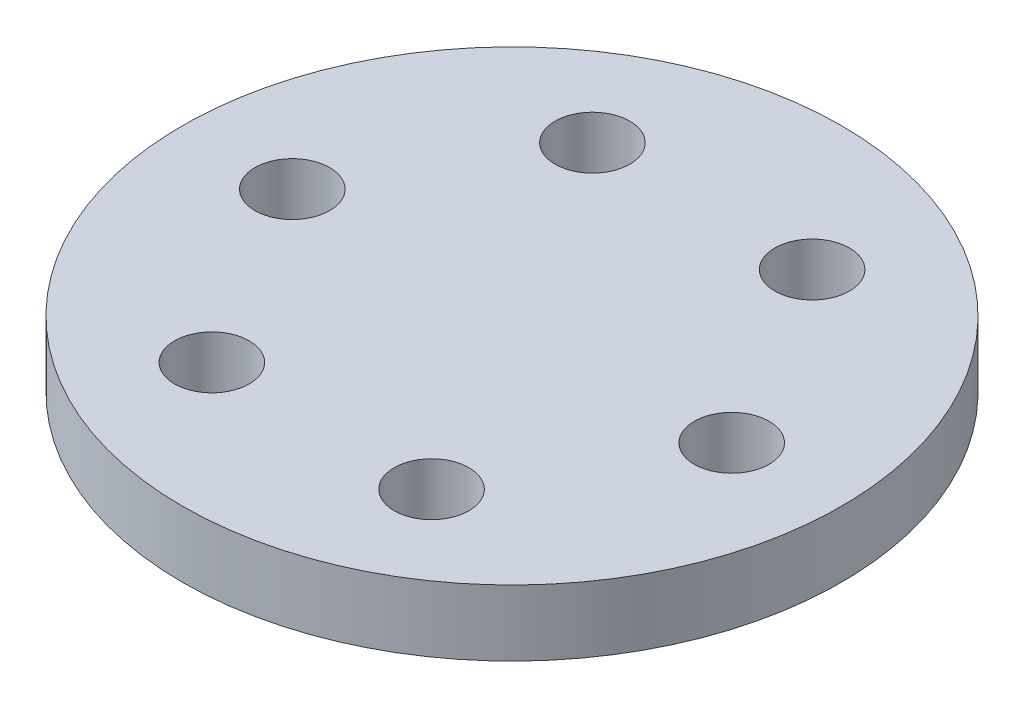
ISO-10303-21;
HEADER;
FILE_DESCRIPTION(('STEP AP214'),'2;1');
FILE_NAME('part.step','',(''),(''),'','','');
FILE_SCHEMA(('AUTOMOTIVE_DESIGN { 1 0 10303 214 1 1 1 1 }'));
ENDSEC;
DATA;
#1=APPLICATION_CONTEXT('core data for automotive mechanical design processes');
#2=APPLICATION_PROTOCOL_DEFINITION('international standard','automotive_design',2000,#1);
#3=PRODUCT_CONTEXT('',#1,'mechanical');
#4=PRODUCT('Part','Part','',(#3));
#5=PRODUCT_RELATED_PRODUCT_CATEGORY('part','',(#4));
#6=PRODUCT_DEFINITION_FORMATION('','',#4);
#7=PRODUCT_DEFINITION_CONTEXT('part definition',#1,'design');
#8=PRODUCT_DEFINITION('design','',#6,#7);
#9=PRODUCT_DEFINITION_SHAPE('','',#8);
#10=(LENGTH_UNIT() NAMED_UNIT(*) SI_UNIT(.MILLI.,.METRE.));
#11=(NAMED_UNIT(*) PLANE_ANGLE_UNIT() SI_UNIT($,.RADIAN.));
#12=(NAMED_UNIT(*) SI_UNIT($,.STERADIAN.) SOLID_ANGLE_UNIT());
#13=UNCERTAINTY_MEASURE_WITH_UNIT(LENGTH_MEASURE(1.E-05),#10,'distance_accuracy_value','');
#14=(GEOMETRIC_REPRESENTATION_CONTEXT(3) GLOBAL_UNCERTAINTY_ASSIGNED_CONTEXT((#13)) GLOBAL_UNIT_ASSIGNED_CONTEXT((#10,
#11,#12)) REPRESENTATION_CONTEXT('',''));
#15=CARTESIAN_POINT('',(0.,0.,0.));
#16=DIRECTION('',(0.,0.,1.));
#17=DIRECTION('',(1.,0.,0.));
#18=AXIS2_PLACEMENT_3D('',#15,#16,#17);
#19=CARTESIAN_POINT('',(0.,3.,0.));
#20=DIRECTION('',(0.,1.,0.));
#21=DIRECTION('',(0.,0.,1.));
#22=AXIS2_PLACEMENT_3D('',#19,#20,#21);
#23=PLANE('',#22);
#24=CARTESIAN_POINT('',(-4.99999999999992,3.,-8.66025403784443));
#25=DIRECTION('',(0.,1.,0.));
#26=DIRECTION('',(0.,0.,1.));
#27=AXIS2_PLACEMENT_3D('',#24,#25,#26);
#28=CIRCLE('',#27,1.7);
#29=CARTESIAN_POINT('',(-4.99999999999992,3.,-6.96025403784443));
#30=VERTEX_POINT('',#29);
#31=EDGE_CURVE('E67',#30,#30,#28,.T.);
#32=ORIENTED_EDGE('',*,*,#31,.F.);
#33=EDGE_LOOP('',(#32));
#34=FACE_BOUND('',#33,.T.);
#35=CARTESIAN_POINT('',(-5.00000000000004,3.,8.66025403784437));
#36=DIRECTION('',(0.,1.,0.));
#37=DIRECTION('',(0.,0.,1.));
#38=AXIS2_PLACEMENT_3D('',#35,#36,#37);
#39=CIRCLE('',#38,1.7);
#40=CARTESIAN_POINT('',(-5.00000000000004,3.,10.3602540378444));
#41=VERTEX_POINT('',#40);
#42=EDGE_CURVE('E55',#41,#41,#39,.T.);
#43=ORIENTED_EDGE('',*,*,#42,.F.);
#44=EDGE_LOOP('',(#43));
#45=FACE_BOUND('',#44,.T.);
#46=CARTESIAN_POINT('',(10.,3.,0.));
#47=DIRECTION('',(0.,1.,0.));
#48=DIRECTION('',(0.,0.,1.));
#49=AXIS2_PLACEMENT_3D('',#46,#47,#48);
#50=CIRCLE('',#49,1.7);
#51=CARTESIAN_POINT('',(10.,3.,1.7));
#52=VERTEX_POINT('',#51);
#53=EDGE_CURVE('E44',#52,#52,#50,.T.);
#54=ORIENTED_EDGE('',*,*,#53,.F.);
#55=EDGE_LOOP('',(#54));
#56=FACE_BOUND('',#55,.T.);
#57=CARTESIAN_POINT('',(0.,3.,0.));
#58=DIRECTION('',(0.,1.,0.));
#59=DIRECTION('',(0.,0.,1.));
#60=AXIS2_PLACEMENT_3D('',#57,#58,#59);
#61=CIRCLE('',#60,15.);
#62=CARTESIAN_POINT('',(0.,3.,15.));
#63=VERTEX_POINT('',#62);
#64=EDGE_CURVE('E10',#63,#63,#61,.T.);
#65=ORIENTED_EDGE('',*,*,#64,.T.);
#66=EDGE_LOOP('',(#65));
#67=FACE_BOUND('',#66,.T.);
#68=CARTESIAN_POINT('',(4.99999999999998,3.,8.6602540378444));
#69=DIRECTION('',(0.,1.,0.));
#70=DIRECTION('',(0.,0.,1.));
#71=AXIS2_PLACEMENT_3D('',#68,#69,#70);
#72=CIRCLE('',#71,1.7);
#73=CARTESIAN_POINT('',(4.99999999999998,3.,10.3602540378444));
#74=VERTEX_POINT('',#73);
#75=EDGE_CURVE('E49',#74,#74,#72,.T.);
#76=ORIENTED_EDGE('',*,*,#75,.F.);
#77=EDGE_LOOP('',(#76));
#78=FACE_BOUND('',#77,.T.);
#79=CARTESIAN_POINT('',(-10.,3.,0.));
#80=DIRECTION('',(0.,1.,0.));
#81=DIRECTION('',(0.,0.,1.));
#82=AXIS2_PLACEMENT_3D('',#79,#80,#81);
#83=CIRCLE('',#82,1.7);
#84=CARTESIAN_POINT('',(-10.,3.,1.69999999999993));
#85=VERTEX_POINT('',#84);
#86=EDGE_CURVE('E61',#85,#85,#83,.T.);
#87=ORIENTED_EDGE('',*,*,#86,.F.);
#88=EDGE_LOOP('',(#87));
#89=FACE_BOUND('',#88,.T.);
#90=CARTESIAN_POINT('',(5.0000000000001,3.,-8.66025403784433));
#91=DIRECTION('',(0.,1.,0.));
#92=DIRECTION('',(0.,0.,1.));
#93=AXIS2_PLACEMENT_3D('',#90,#91,#92);
#94=CIRCLE('',#93,1.7);
#95=CARTESIAN_POINT('',(5.0000000000001,3.,-6.96025403784433));
#96=VERTEX_POINT('',#95);
#97=EDGE_CURVE('E73',#96,#96,#94,.T.);
#98=ORIENTED_EDGE('',*,*,#97,.F.);
#99=EDGE_LOOP('',(#98));
#100=FACE_BOUND('',#99,.T.);
#101=ADVANCED_FACE('F33',(#34,#45,#56,#67,#78,#89,#100),#23,.T.);
#102=CARTESIAN_POINT('',(0.,0.,0.));
#103=DIRECTION('',(0.,1.,0.));
#104=DIRECTION('',(0.,0.,1.));
#105=AXIS2_PLACEMENT_3D('',#102,#103,#104);
#106=PLANE('',#105);
#107=CARTESIAN_POINT('',(0.,0.,0.));
#108=DIRECTION('',(0.,1.,0.));
#109=DIRECTION('',(0.,0.,1.));
#110=AXIS2_PLACEMENT_3D('',#107,#108,#109);
#111=CIRCLE('',#110,15.);
#112=CARTESIAN_POINT('',(0.,0.,15.));
#113=VERTEX_POINT('',#112);
#114=EDGE_CURVE('E37',#113,#113,#111,.T.);
#115=ORIENTED_EDGE('',*,*,#114,.F.);
#116=EDGE_LOOP('',(#115));
#117=FACE_BOUND('',#116,.T.);
#118=CARTESIAN_POINT('',(10.,0.,0.));
#119=DIRECTION('',(0.,1.,0.));
#120=DIRECTION('',(0.,0.,1.));
#121=AXIS2_PLACEMENT_3D('',#118,#119,#120);
#122=CIRCLE('',#121,1.7);
#123=CARTESIAN_POINT('',(10.,0.,1.7));
#124=VERTEX_POINT('',#123);
#125=EDGE_CURVE('E46',#124,#124,#122,.T.);
#126=ORIENTED_EDGE('',*,*,#125,.T.);
#127=EDGE_LOOP('',(#126));
#128=FACE_BOUND('',#127,.T.);
#129=CARTESIAN_POINT('',(4.99999999999998,0.,8.6602540378444));
#130=DIRECTION('',(0.,1.,0.));
#131=DIRECTION('',(0.,0.,1.));
#132=AXIS2_PLACEMENT_3D('',#129,#130,#131);
#133=CIRCLE('',#132,1.7);
#134=CARTESIAN_POINT('',(4.99999999999998,0.,10.3602540378444));
#135=VERTEX_POINT('',#134);
#136=EDGE_CURVE('E52',#135,#135,#133,.T.);
#137=ORIENTED_EDGE('',*,*,#136,.T.);
#138=EDGE_LOOP('',(#137));
#139=FACE_BOUND('',#138,.T.);
#140=CARTESIAN_POINT('',(-5.00000000000004,0.,8.66025403784437));
#141=DIRECTION('',(0.,1.,0.));
#142=DIRECTION('',(0.,0.,1.));
#143=AXIS2_PLACEMENT_3D('',#140,#141,#142);
#144=CIRCLE('',#143,1.7);
#145=CARTESIAN_POINT('',(-5.00000000000004,0.,10.3602540378444));
#146=VERTEX_POINT('',#145);
#147=EDGE_CURVE('E58',#146,#146,#144,.T.);
#148=ORIENTED_EDGE('',*,*,#147,.T.);
#149=EDGE_LOOP('',(#148));
#150=FACE_BOUND('',#149,.T.);
#151=CARTESIAN_POINT('',(-10.,0.,0.));
#152=DIRECTION('',(0.,1.,0.));
#153=DIRECTION('',(0.,0.,1.));
#154=AXIS2_PLACEMENT_3D('',#151,#152,#153);
#155=CIRCLE('',#154,1.7);
#156=CARTESIAN_POINT('',(-10.,0.,1.69999999999993));
#157=VERTEX_POINT('',#156);
#158=EDGE_CURVE('E64',#157,#157,#155,.T.);
#159=ORIENTED_EDGE('',*,*,#158,.T.);
#160=EDGE_LOOP('',(#159));
#161=FACE_BOUND('',#160,.T.);
#162=CARTESIAN_POINT('',(-4.99999999999992,0.,-8.66025403784443));
#163=DIRECTION('',(0.,1.,0.));
#164=DIRECTION('',(0.,0.,1.));
#165=AXIS2_PLACEMENT_3D('',#162,#163,#164);
#166=CIRCLE('',#165,1.7);
#167=CARTESIAN_POINT('',(-4.99999999999992,0.,-6.96025403784443));
#168=VERTEX_POINT('',#167);
#169=EDGE_CURVE('E70',#168,#168,#166,.T.);
#170=ORIENTED_EDGE('',*,*,#169,.T.);
#171=EDGE_LOOP('',(#170));
#172=FACE_BOUND('',#171,.T.);
#173=CARTESIAN_POINT('',(5.0000000000001,0.,-8.66025403784433));
#174=DIRECTION('',(0.,1.,0.));
#175=DIRECTION('',(0.,0.,1.));
#176=AXIS2_PLACEMENT_3D('',#173,#174,#175);
#177=CIRCLE('',#176,1.7);
#178=CARTESIAN_POINT('',(5.0000000000001,0.,-6.96025403784433));
#179=VERTEX_POINT('',#178);
#180=EDGE_CURVE('E76',#179,#179,#177,.T.);
#181=ORIENTED_EDGE('',*,*,#180,.T.);
#182=EDGE_LOOP('',(#181));
#183=FACE_BOUND('',#182,.T.);
#184=ADVANCED_FACE('F86',(#117,#128,#139,#150,#161,#172,#183),#106,.F.);
#185=CARTESIAN_POINT('',(0.,3.,0.));
#186=DIRECTION('',(0.,-1.,0.));
#187=DIRECTION('',(0.,0.,-1.));
#188=AXIS2_PLACEMENT_3D('',#185,#186,#187);
#189=CYLINDRICAL_SURFACE('',#188,15.);
#190=ORIENTED_EDGE('',*,*,#64,.F.);
#191=EDGE_LOOP('',(#190));
#192=FACE_BOUND('',#191,.T.);
#193=ORIENTED_EDGE('',*,*,#114,.T.);
#194=EDGE_LOOP('',(#193));
#195=FACE_BOUND('',#194,.T.);
#196=ADVANCED_FACE('F35',(#192,#195),#189,.T.);
#197=CARTESIAN_POINT('',(10.,3.,0.));
#198=DIRECTION('',(0.,-1.,0.));
#199=DIRECTION('',(0.,0.,-1.));
#200=AXIS2_PLACEMENT_3D('',#197,#198,#199);
#201=CYLINDRICAL_SURFACE('',#200,1.7);
#202=ORIENTED_EDGE('',*,*,#53,.T.);
#203=EDGE_LOOP('',(#202));
#204=FACE_BOUND('',#203,.T.);
#205=ORIENTED_EDGE('',*,*,#125,.F.);
#206=EDGE_LOOP('',(#205));
#207=FACE_BOUND('',#206,.T.);
#208=ADVANCED_FACE('F96',(#204,#207),#201,.F.);
#209=CARTESIAN_POINT('',(4.99999999999998,3.,8.6602540378444));
#210=DIRECTION('',(0.,-1.,0.));
#211=DIRECTION('',(0.,0.,-1.));
#212=AXIS2_PLACEMENT_3D('',#209,#210,#211);
#213=CYLINDRICAL_SURFACE('',#212,1.7);
#214=ORIENTED_EDGE('',*,*,#75,.T.);
#215=EDGE_LOOP('',(#214));
#216=FACE_BOUND('',#215,.T.);
#217=ORIENTED_EDGE('',*,*,#136,.F.);
#218=EDGE_LOOP('',(#217));
#219=FACE_BOUND('',#218,.T.);
#220=ADVANCED_FACE('F99',(#216,#219),#213,.F.);
#221=CARTESIAN_POINT('',(-5.00000000000004,3.,8.66025403784437));
#222=DIRECTION('',(0.,-1.,0.));
#223=DIRECTION('',(0.,0.,-1.));
#224=AXIS2_PLACEMENT_3D('',#221,#222,#223);
#225=CYLINDRICAL_SURFACE('',#224,1.7);
#226=ORIENTED_EDGE('',*,*,#42,.T.);
#227=EDGE_LOOP('',(#226));
#228=FACE_BOUND('',#227,.T.);
#229=ORIENTED_EDGE('',*,*,#147,.F.);
#230=EDGE_LOOP('',(#229));
#231=FACE_BOUND('',#230,.T.);
#232=ADVANCED_FACE('F103',(#228,#231),#225,.F.);
#233=CARTESIAN_POINT('',(-10.,3.,0.));
#234=DIRECTION('',(0.,-1.,0.));
#235=DIRECTION('',(0.,0.,-1.));
#236=AXIS2_PLACEMENT_3D('',#233,#234,#235);
#237=CYLINDRICAL_SURFACE('',#236,1.7);
#238=ORIENTED_EDGE('',*,*,#86,.T.);
#239=EDGE_LOOP('',(#238));
#240=FACE_BOUND('',#239,.T.);
#241=ORIENTED_EDGE('',*,*,#158,.F.);
#242=EDGE_LOOP('',(#241));
#243=FACE_BOUND('',#242,.T.);
#244=ADVANCED_FACE('F107',(#240,#243),#237,.F.);
#245=CARTESIAN_POINT('',(-4.99999999999992,3.,-8.66025403784443));
#246=DIRECTION('',(0.,-1.,0.));
#247=DIRECTION('',(0.,0.,-1.));
#248=AXIS2_PLACEMENT_3D('',#245,#246,#247);
#249=CYLINDRICAL_SURFACE('',#248,1.7);
#250=ORIENTED_EDGE('',*,*,#31,.T.);
#251=EDGE_LOOP('',(#250));
#252=FACE_BOUND('',#251,.T.);
#253=ORIENTED_EDGE('',*,*,#169,.F.);
#254=EDGE_LOOP('',(#253));
#255=FACE_BOUND('',#254,.T.);
#256=ADVANCED_FACE('F111',(#252,#255),#249,.F.);
#257=CARTESIAN_POINT('',(5.0000000000001,3.,-8.66025403784433));
#258=DIRECTION('',(0.,-1.,0.));
#259=DIRECTION('',(0.,0.,-1.));
#260=AXIS2_PLACEMENT_3D('',#257,#258,#259);
#261=CYLINDRICAL_SURFACE('',#260,1.7);
#262=ORIENTED_EDGE('',*,*,#97,.T.);
#263=EDGE_LOOP('',(#262));
#264=FACE_BOUND('',#263,.T.);
#265=ORIENTED_EDGE('',*,*,#180,.F.);
#266=EDGE_LOOP('',(#265));
#267=FACE_BOUND('',#266,.T.);
#268=ADVANCED_FACE('F82',(#264,#267),#261,.F.);
#269=CLOSED_SHELL('',(#101,#184,#196,#208,#220,#232,#244,#256,#268));
#270=MANIFOLD_SOLID_BREP('B2',#269);
#271=ADVANCED_BREP_SHAPE_REPRESENTATION('',(#18,#270),#14);
#272=SHAPE_DEFINITION_REPRESENTATION(#9,#271);
ENDSEC;
END-ISO-10303-21;
